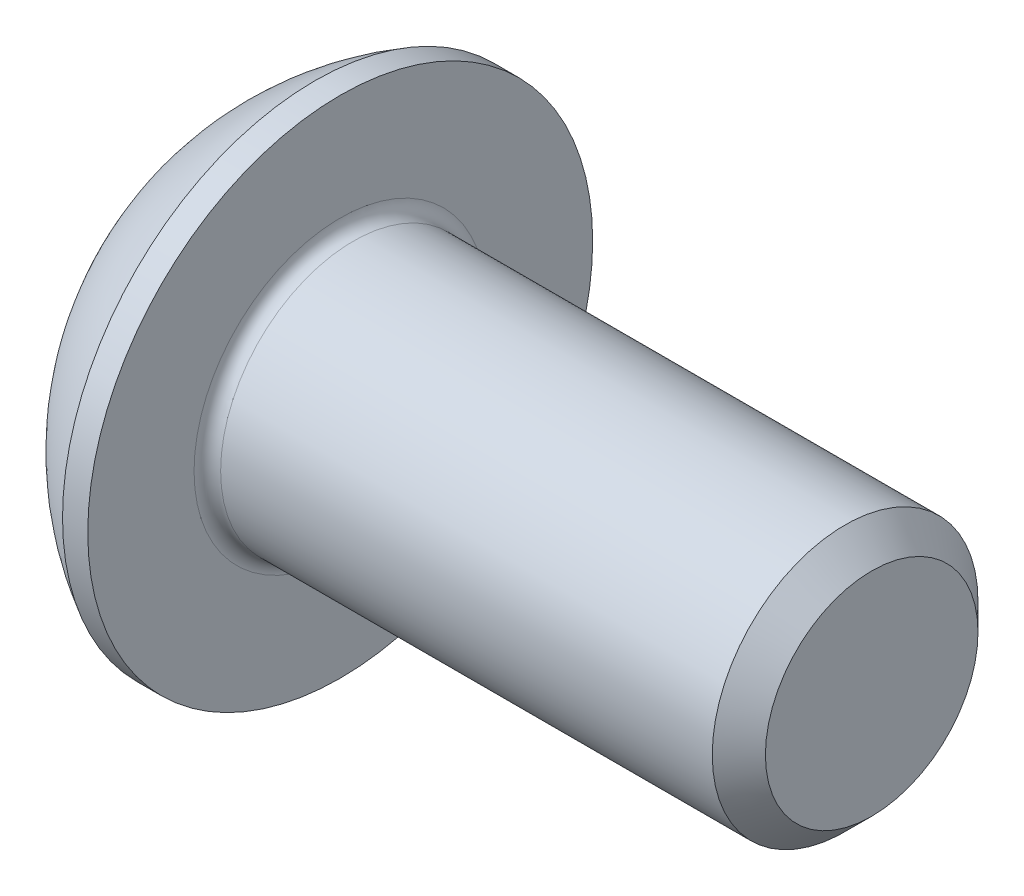
ISO-10303-21;
HEADER;
FILE_DESCRIPTION(('STEP AP214'),'2;1');
FILE_NAME('part.step','',(''),(''),'','','');
FILE_SCHEMA(('AUTOMOTIVE_DESIGN { 1 0 10303 214 1 1 1 1 }'));
ENDSEC;
DATA;
#1=APPLICATION_CONTEXT('core data for automotive mechanical design processes');
#2=APPLICATION_PROTOCOL_DEFINITION('international standard','automotive_design',2000,#1);
#3=PRODUCT_CONTEXT('',#1,'mechanical');
#4=PRODUCT('Part','Part','',(#3));
#5=PRODUCT_RELATED_PRODUCT_CATEGORY('part','',(#4));
#6=PRODUCT_DEFINITION_FORMATION('','',#4);
#7=PRODUCT_DEFINITION_CONTEXT('part definition',#1,'design');
#8=PRODUCT_DEFINITION('design','',#6,#7);
#9=PRODUCT_DEFINITION_SHAPE('','',#8);
#10=(LENGTH_UNIT() NAMED_UNIT(*) SI_UNIT(.MILLI.,.METRE.));
#11=(NAMED_UNIT(*) PLANE_ANGLE_UNIT() SI_UNIT($,.RADIAN.));
#12=(NAMED_UNIT(*) SI_UNIT($,.STERADIAN.) SOLID_ANGLE_UNIT());
#13=UNCERTAINTY_MEASURE_WITH_UNIT(LENGTH_MEASURE(1.E-05),#10,'distance_accuracy_value','');
#14=(GEOMETRIC_REPRESENTATION_CONTEXT(3) GLOBAL_UNCERTAINTY_ASSIGNED_CONTEXT((#13)) GLOBAL_UNIT_ASSIGNED_CONTEXT((#10,
#11,#12)) REPRESENTATION_CONTEXT('',''));
#15=CARTESIAN_POINT('',(0.,0.,0.));
#16=DIRECTION('',(0.,0.,1.));
#17=DIRECTION('',(1.,0.,0.));
#18=AXIS2_PLACEMENT_3D('',#15,#16,#17);
#19=CARTESIAN_POINT('',(0.,0.,0.));
#20=DIRECTION('',(-1.,0.,0.));
#21=DIRECTION('',(0.,0.,1.));
#22=AXIS2_PLACEMENT_3D('',#19,#20,#21);
#23=PLANE('',#22);
#24=CARTESIAN_POINT('',(0.,0.,0.));
#25=DIRECTION('',(-1.,0.,0.));
#26=DIRECTION('',(0.,0.,1.));
#27=AXIS2_PLACEMENT_3D('',#24,#25,#26);
#28=CIRCLE('',#27,1.9);
#29=CARTESIAN_POINT('',(0.,1.9,0.));
#30=VERTEX_POINT('',#29);
#31=EDGE_CURVE('E158',#30,#30,#28,.T.);
#32=ORIENTED_EDGE('',*,*,#31,.T.);
#33=EDGE_LOOP('',(#32));
#34=FACE_BOUND('',#33,.T.);
#35=DIRECTION('',(0.,-1.,0.));
#36=VECTOR('',#35,1.);
#37=CARTESIAN_POINT('',(0.,-0.721687836487032,1.25));
#38=LINE('',#37,#36);
#39=CARTESIAN_POINT('',(0.,0.721687836487033,1.25));
#40=VERTEX_POINT('',#39);
#41=CARTESIAN_POINT('',(0.,-0.721687836487032,1.25));
#42=VERTEX_POINT('',#41);
#43=EDGE_CURVE('E59',#40,#42,#38,.T.);
#44=ORIENTED_EDGE('',*,*,#43,.T.);
#45=DIRECTION('',(0.,-0.5,-0.866025403784438));
#46=VECTOR('',#45,1.);
#47=CARTESIAN_POINT('',(0.,-1.44337567297406,0.));
#48=LINE('',#47,#46);
#49=CARTESIAN_POINT('',(0.,-1.44337567297406,0.));
#50=VERTEX_POINT('',#49);
#51=EDGE_CURVE('E294',#42,#50,#48,.T.);
#52=ORIENTED_EDGE('',*,*,#51,.T.);
#53=DIRECTION('',(0.,0.5,-0.866025403784438));
#54=VECTOR('',#53,1.);
#55=CARTESIAN_POINT('',(0.,-0.721687836487032,-1.25));
#56=LINE('',#55,#54);
#57=CARTESIAN_POINT('',(0.,-0.721687836487032,-1.25));
#58=VERTEX_POINT('',#57);
#59=EDGE_CURVE('E139',#50,#58,#56,.T.);
#60=ORIENTED_EDGE('',*,*,#59,.T.);
#61=DIRECTION('',(0.,1.,0.));
#62=VECTOR('',#61,1.);
#63=CARTESIAN_POINT('',(0.,0.721687836487033,-1.25));
#64=LINE('',#63,#62);
#65=CARTESIAN_POINT('',(0.,0.721687836487033,-1.25));
#66=VERTEX_POINT('',#65);
#67=EDGE_CURVE('E297',#58,#66,#64,.T.);
#68=ORIENTED_EDGE('',*,*,#67,.T.);
#69=DIRECTION('',(0.,0.5,0.866025403784439));
#70=VECTOR('',#69,1.);
#71=CARTESIAN_POINT('',(0.,1.44337567297406,0.));
#72=LINE('',#71,#70);
#73=CARTESIAN_POINT('',(0.,1.44337567297406,0.));
#74=VERTEX_POINT('',#73);
#75=EDGE_CURVE('E299',#66,#74,#72,.T.);
#76=ORIENTED_EDGE('',*,*,#75,.T.);
#77=DIRECTION('',(0.,-0.5,0.866025403784439));
#78=VECTOR('',#77,1.);
#79=CARTESIAN_POINT('',(0.,0.721687836487033,1.25));
#80=LINE('',#79,#78);
#81=EDGE_CURVE('E301',#74,#40,#80,.T.);
#82=ORIENTED_EDGE('',*,*,#81,.T.);
#83=EDGE_LOOP('',(#44,#52,#60,#68,#76,#82));
#84=FACE_BOUND('',#83,.T.);
#85=ADVANCED_FACE('F43',(#34,#84),#23,.T.);
#86=CARTESIAN_POINT('',(3.88527472527473,0.,0.));
#87=DIRECTION('',(-1.,0.,0.));
#88=DIRECTION('',(0.,1.,0.));
#89=AXIS2_PLACEMENT_3D('',#86,#87,#88);
#90=SPHERICAL_SURFACE('',#89,4.3249693283142);
#91=CARTESIAN_POINT('',(1.82,0.,0.));
#92=DIRECTION('',(-1.,0.,0.));
#93=DIRECTION('',(0.,0.,1.));
#94=AXIS2_PLACEMENT_3D('',#91,#92,#93);
#95=CIRCLE('',#94,3.8);
#96=CARTESIAN_POINT('',(1.82,3.8,0.));
#97=VERTEX_POINT('',#96);
#98=EDGE_CURVE('E155',#97,#97,#95,.T.);
#99=CARTESIAN_POINT('',(1.82,3.8,0.));
#100=CARTESIAN_POINT('',(1.79553223778235,3.78670197498787,0.));
#101=CARTESIAN_POINT('',(1.77119294730718,3.77316757105695,0.));
#102=CARTESIAN_POINT('',(1.72278031308152,3.74563119292022,0.));
#103=CARTESIAN_POINT('',(1.69870696933104,3.7316292187144,0.));
#104=CARTESIAN_POINT('',(1.65083523179446,3.7031628875906,0.));
#105=CARTESIAN_POINT('',(1.62703683800837,3.6886985306726,0.));
#106=CARTESIAN_POINT('',(1.57972387446203,3.65931284095831,0.));
#107=CARTESIAN_POINT('',(1.55620930470177,3.64439150816201,0.));
#108=CARTESIAN_POINT('',(1.50947276449225,3.61409743150663,0.));
#109=CARTESIAN_POINT('',(1.48625079404298,3.59872468764754,0.));
#110=CARTESIAN_POINT('',(1.44010811665664,3.56753352546924,0.));
#111=CARTESIAN_POINT('',(1.41718740971957,3.55171510715004,0.));
#112=CARTESIAN_POINT('',(1.37165581166264,3.51963849804541,0.));
#113=CARTESIAN_POINT('',(1.34904492054277,3.50338030725998,0.));
#114=CARTESIAN_POINT('',(1.30414139068938,3.47043021954608,0.));
#115=CARTESIAN_POINT('',(1.28184875195586,3.4537383226176,0.));
#116=CARTESIAN_POINT('',(1.23759004473439,3.41992705070111,0.));
#117=CARTESIAN_POINT('',(1.21562397624644,3.40280767571308,0.));
#118=CARTESIAN_POINT('',(1.17202660551528,3.3681478352793,0.));
#119=CARTESIAN_POINT('',(1.15039530327208,3.35060736983354,0.));
#120=CARTESIAN_POINT('',(1.10747553612391,3.31511189319918,0.));
#121=CARTESIAN_POINT('',(1.08618707121895,3.29715688201057,0.));
#122=CARTESIAN_POINT('',(1.04396092192025,3.26083901328234,0.));
#123=CARTESIAN_POINT('',(1.02302323752651,3.24247615574272,0.));
#124=CARTESIAN_POINT('',(0.981506461539866,3.20534944588,0.));
#125=CARTESIAN_POINT('',(0.960927369946953,3.18658559355691,0.));
#126=CARTESIAN_POINT('',(0.920135458053,3.14866389531445,0.));
#127=CARTESIAN_POINT('',(0.89992263775196,3.12950604939509,0.));
#128=CARTESIAN_POINT('',(0.859870810269304,3.09080351215454,0.));
#129=CARTESIAN_POINT('',(0.84003180308769,3.07125882083336,0.));
#130=CARTESIAN_POINT('',(0.800735004193914,3.0317898853238,0.));
#131=CARTESIAN_POINT('',(0.781277212481753,3.01186564113541,0.));
#132=CARTESIAN_POINT('',(0.74275010463742,2.97164503404517,0.));
#133=CARTESIAN_POINT('',(0.723680788505248,2.95134867114332,0.));
#134=CARTESIAN_POINT('',(0.685937746983035,2.91039139962521,0.));
#135=CARTESIAN_POINT('',(0.667264021592994,2.88973049100894,0.));
#136=CARTESIAN_POINT('',(0.630319129113974,2.84805183708071,0.));
#137=CARTESIAN_POINT('',(0.612047962024996,2.82703409176873,0.));
#138=CARTESIAN_POINT('',(0.575915003504077,2.78464960661105,0.));
#139=CARTESIAN_POINT('',(0.558053212072136,2.76328286676534,0.));
#140=CARTESIAN_POINT('',(0.522745669474639,2.72020836491933,0.));
#141=CARTESIAN_POINT('',(0.505299918309083,2.69850060291903,0.));
#142=CARTESIAN_POINT('',(0.470830965620255,2.65475215638556,0.));
#143=CARTESIAN_POINT('',(0.453807764096983,2.63271147185239,0.));
#144=CARTESIAN_POINT('',(0.420190262406823,2.58830540409509,0.));
#145=CARTESIAN_POINT('',(0.403595962239934,2.56594002087097,0.));
#146=CARTESIAN_POINT('',(0.370842454943267,2.52089290072626,0.));
#147=CARTESIAN_POINT('',(0.354683247813489,2.49821116380567,0.));
#148=CARTESIAN_POINT('',(0.322805955934172,2.45253979929826,0.));
#149=CARTESIAN_POINT('',(0.307087871184632,2.42955017171145,0.));
#150=CARTESIAN_POINT('',(0.276098688799191,2.38327160379141,0.));
#151=CARTESIAN_POINT('',(0.26082759116329,2.35998266345818,0.));
#152=CARTESIAN_POINT('',(0.230738081024336,2.31311415961106,0.));
#153=CARTESIAN_POINT('',(0.215919668521284,2.28953459609717,0.));
#154=CARTESIAN_POINT('',(0.186741057514276,2.24209364401868,0.));
#155=CARTESIAN_POINT('',(0.172380859010322,2.21823225545407,0.));
#156=CARTESIAN_POINT('',(0.144124034818959,2.17023655608655,0.));
#157=CARTESIAN_POINT('',(0.13022740913155,2.14610224528364,0.));
#158=CARTESIAN_POINT('',(0.102902912986768,2.09756970784785,0.));
#159=CARTESIAN_POINT('',(0.0894750425293929,2.07317148121498,0.));
#160=CARTESIAN_POINT('',(0.0630930771761377,2.02412021042083,0.));
#161=CARTESIAN_POINT('',(0.0501389822802572,1.99946716625955,0.));
#162=CARTESIAN_POINT('',(0.0247093637594994,1.94991547834234,0.));
#163=CARTESIAN_POINT('',(0.0122338401346221,1.9250168345864,0.));
#164=CARTESIAN_POINT('',(0.,1.9,0.));
#165=B_SPLINE_CURVE_WITH_KNOTS('',3,(#99,#100,#101,#102,#103,#104,#105,#106,#107,#108,#109,#110,
#111,#112,#113,#114,#115,#116,#117,#118,#119,#120,#121,#122,#123,#124,#125,#126,#127,#128,#129,
#130,#131,#132,#133,#134,#135,#136,#137,#138,#139,#140,#141,#142,#143,#144,#145,#146,#147,#148,
#149,#150,#151,#152,#153,#154,#155,#156,#157,#158,#159,#160,#161,#162,#163,#164),.UNSPECIFIED.,
.F.,.F.,(4,2,2,2,2,2,2,2,2,2,2,2,2,2,2,2,2,2,2,2,2,2,2,2,2,2,2,2,2,2,2,2,4),(0.,
0.083542578086179,0.167085156172358,0.250627734258537,0.334170312344716,0.417712890430896,
0.501255468517075,0.584798046603254,0.668340624689433,0.751883202775612,0.835425780861791,
0.91896835894797,1.00251093703415,1.08605351512033,1.16959609320651,1.25313867129269,
1.33668124937887,1.42022382746504,1.50376640555122,1.5873089836374,1.67085156172358,
1.75439413980976,1.83793671789594,1.92147929598212,2.0050218740683,2.08856445215448,
2.17210703024066,2.25564960832684,2.33919218641302,2.42273476449919,2.50627734258537,
2.58981992067155,2.67336249875773),.UNSPECIFIED.);
#166=EDGE_CURVE('BSEAM180',#97,#30,#165,.T.);
#167=ORIENTED_EDGE('',*,*,#98,.T.);
#168=ORIENTED_EDGE('',*,*,#31,.F.);
#169=ORIENTED_EDGE('',*,*,#166,.T.);
#170=ORIENTED_EDGE('',*,*,#166,.F.);
#171=EDGE_LOOP('',(#167,#169,#168,#170));
#172=FACE_BOUND('',#171,.T.);
#173=ADVANCED_FACE('F180',(#172),#90,.T.);
#174=CARTESIAN_POINT('',(0.,0.,0.));
#175=DIRECTION('',(-1.,0.,0.));
#176=DIRECTION('',(0.,0.,1.));
#177=AXIS2_PLACEMENT_3D('',#174,#175,#176);
#178=CYLINDRICAL_SURFACE('',#177,3.8);
#179=ORIENTED_EDGE('',*,*,#98,.F.);
#180=EDGE_LOOP('',(#179));
#181=FACE_BOUND('',#180,.T.);
#182=CARTESIAN_POINT('',(2.2,0.,0.));
#183=DIRECTION('',(-1.,0.,0.));
#184=DIRECTION('',(0.,0.,1.));
#185=AXIS2_PLACEMENT_3D('',#182,#183,#184);
#186=CIRCLE('',#185,3.8);
#187=CARTESIAN_POINT('',(2.2,0.,3.8));
#188=VERTEX_POINT('',#187);
#189=EDGE_CURVE('E151',#188,#188,#186,.T.);
#190=ORIENTED_EDGE('',*,*,#189,.T.);
#191=EDGE_LOOP('',(#190));
#192=FACE_BOUND('',#191,.T.);
#193=ADVANCED_FACE('F187',(#181,#192),#178,.T.);
#194=CARTESIAN_POINT('',(2.2,2.,0.));
#195=DIRECTION('',(-1.,0.,0.));
#196=DIRECTION('',(0.,0.,1.));
#197=AXIS2_PLACEMENT_3D('',#194,#195,#196);
#198=PLANE('',#197);
#199=CARTESIAN_POINT('',(2.2,0.,0.));
#200=DIRECTION('',(-1.,0.,0.));
#201=DIRECTION('',(0.,0.,1.));
#202=AXIS2_PLACEMENT_3D('',#199,#200,#201);
#203=CIRCLE('',#202,2.2);
#204=CARTESIAN_POINT('',(2.2,0.,2.2));
#205=VERTEX_POINT('',#204);
#206=EDGE_CURVE('E161',#205,#205,#203,.T.);
#207=ORIENTED_EDGE('',*,*,#206,.T.);
#208=EDGE_LOOP('',(#207));
#209=FACE_BOUND('',#208,.T.);
#210=ORIENTED_EDGE('',*,*,#189,.F.);
#211=EDGE_LOOP('',(#210));
#212=FACE_BOUND('',#211,.T.);
#213=ADVANCED_FACE('F199',(#209,#212),#198,.F.);
#214=CARTESIAN_POINT('',(0.,0.,0.));
#215=DIRECTION('',(-1.,0.,0.));
#216=DIRECTION('',(0.,0.,1.));
#217=AXIS2_PLACEMENT_3D('',#214,#215,#216);
#218=CYLINDRICAL_SURFACE('',#217,2.);
#219=CARTESIAN_POINT('',(9.8,0.,0.));
#220=DIRECTION('',(-1.,0.,0.));
#221=DIRECTION('',(0.,0.,1.));
#222=AXIS2_PLACEMENT_3D('',#219,#220,#221);
#223=CIRCLE('',#222,2.);
#224=CARTESIAN_POINT('',(9.8,0.,2.));
#225=VERTEX_POINT('',#224);
#226=EDGE_CURVE('E11',#225,#225,#223,.T.);
#227=ORIENTED_EDGE('',*,*,#226,.T.);
#228=EDGE_LOOP('',(#227));
#229=FACE_BOUND('',#228,.T.);
#230=CARTESIAN_POINT('',(2.4,0.,0.));
#231=DIRECTION('',(-1.,0.,0.));
#232=DIRECTION('',(0.,0.,1.));
#233=AXIS2_PLACEMENT_3D('',#230,#231,#232);
#234=CIRCLE('',#233,2.);
#235=CARTESIAN_POINT('',(2.4,0.,2.));
#236=VERTEX_POINT('',#235);
#237=EDGE_CURVE('E164',#236,#236,#234,.F.);
#238=ORIENTED_EDGE('',*,*,#237,.T.);
#239=EDGE_LOOP('',(#238));
#240=FACE_BOUND('',#239,.T.);
#241=ADVANCED_FACE('F193',(#229,#240),#218,.T.);
#242=CARTESIAN_POINT('',(2.4,0.,0.));
#243=DIRECTION('',(-1.,0.,0.));
#244=DIRECTION('',(0.,0.,1.));
#245=AXIS2_PLACEMENT_3D('',#242,#243,#244);
#246=TOROIDAL_SURFACE('',#245,2.2,0.2);
#247=ORIENTED_EDGE('',*,*,#237,.F.);
#248=EDGE_LOOP('',(#247));
#249=FACE_BOUND('',#248,.T.);
#250=ORIENTED_EDGE('',*,*,#206,.F.);
#251=EDGE_LOOP('',(#250));
#252=FACE_BOUND('',#251,.T.);
#253=ADVANCED_FACE('F191',(#249,#252),#246,.F.);
#254=CARTESIAN_POINT('',(1.3,-1.44337567297406,0.));
#255=DIRECTION('',(0.,0.866025403784438,-0.5));
#256=DIRECTION('',(0.,0.5,0.866025403784438));
#257=AXIS2_PLACEMENT_3D('',#254,#255,#256);
#258=PLANE('',#257);
#259=DIRECTION('',(0.,-0.5,-0.866025403784438));
#260=VECTOR('',#259,1.);
#261=CARTESIAN_POINT('',(1.3,-1.44337567297406,0.));
#262=LINE('',#261,#260);
#263=CARTESIAN_POINT('',(1.3,-0.721687836487032,1.25));
#264=VERTEX_POINT('',#263);
#265=CARTESIAN_POINT('',(1.3,-1.08253175473055,0.625));
#266=VERTEX_POINT('',#265);
#267=EDGE_CURVE('E125',#264,#266,#262,.T.);
#268=ORIENTED_EDGE('',*,*,#267,.T.);
#269=CARTESIAN_POINT('',(1.3,-1.44337567297406,0.));
#270=VERTEX_POINT('',#269);
#271=EDGE_CURVE('E120',#266,#270,#262,.T.);
#272=ORIENTED_EDGE('',*,*,#271,.T.);
#273=DIRECTION('',(-1.,0.,0.));
#274=VECTOR('',#273,1.);
#275=CARTESIAN_POINT('',(1.3,-1.44337567297406,0.));
#276=LINE('',#275,#274);
#277=EDGE_CURVE('E122',#270,#50,#276,.T.);
#278=ORIENTED_EDGE('',*,*,#277,.T.);
#279=ORIENTED_EDGE('',*,*,#51,.F.);
#280=DIRECTION('',(-1.,0.,0.));
#281=VECTOR('',#280,1.);
#282=CARTESIAN_POINT('',(1.3,-0.721687836487032,1.25));
#283=LINE('',#282,#281);
#284=EDGE_CURVE('E290',#264,#42,#283,.T.);
#285=ORIENTED_EDGE('',*,*,#284,.F.);
#286=EDGE_LOOP('',(#268,#272,#278,#279,#285));
#287=FACE_BOUND('',#286,.T.);
#288=ADVANCED_FACE('F121',(#287),#258,.T.);
#289=CARTESIAN_POINT('',(1.3,-0.721687836487032,-1.25));
#290=DIRECTION('',(0.,0.866025403784439,0.5));
#291=DIRECTION('',(0.,-0.5,0.866025403784439));
#292=AXIS2_PLACEMENT_3D('',#289,#290,#291);
#293=PLANE('',#292);
#294=DIRECTION('',(0.,0.5,-0.866025403784438));
#295=VECTOR('',#294,1.);
#296=CARTESIAN_POINT('',(1.3,-0.721687836487032,-1.25));
#297=LINE('',#296,#295);
#298=CARTESIAN_POINT('',(1.3,-1.08253175473055,-0.625));
#299=VERTEX_POINT('',#298);
#300=EDGE_CURVE('E67',#270,#299,#297,.T.);
#301=ORIENTED_EDGE('',*,*,#300,.T.);
#302=CARTESIAN_POINT('',(1.3,-0.721687836487032,-1.25));
#303=VERTEX_POINT('',#302);
#304=EDGE_CURVE('E134',#299,#303,#297,.T.);
#305=ORIENTED_EDGE('',*,*,#304,.T.);
#306=DIRECTION('',(-1.,0.,0.));
#307=VECTOR('',#306,1.);
#308=CARTESIAN_POINT('',(1.3,-0.721687836487032,-1.25));
#309=LINE('',#308,#307);
#310=EDGE_CURVE('E141',#303,#58,#309,.T.);
#311=ORIENTED_EDGE('',*,*,#310,.T.);
#312=ORIENTED_EDGE('',*,*,#59,.F.);
#313=ORIENTED_EDGE('',*,*,#277,.F.);
#314=EDGE_LOOP('',(#301,#305,#311,#312,#313));
#315=FACE_BOUND('',#314,.T.);
#316=ADVANCED_FACE('F137',(#315),#293,.T.);
#317=CARTESIAN_POINT('',(1.3,0.721687836487033,-1.25));
#318=DIRECTION('',(0.,0.,1.));
#319=DIRECTION('',(1.,0.,0.));
#320=AXIS2_PLACEMENT_3D('',#317,#318,#319);
#321=PLANE('',#320);
#322=DIRECTION('',(0.,1.,0.));
#323=VECTOR('',#322,1.);
#324=CARTESIAN_POINT('',(1.3,0.721687836487033,-1.25));
#325=LINE('',#324,#323);
#326=CARTESIAN_POINT('',(1.3,0.,-1.25));
#327=VERTEX_POINT('',#326);
#328=EDGE_CURVE('E271',#303,#327,#325,.T.);
#329=ORIENTED_EDGE('',*,*,#328,.T.);
#330=CARTESIAN_POINT('',(1.3,0.721687836487033,-1.25));
#331=VERTEX_POINT('',#330);
#332=EDGE_CURVE('E133',#327,#331,#325,.T.);
#333=ORIENTED_EDGE('',*,*,#332,.T.);
#334=DIRECTION('',(-1.,0.,0.));
#335=VECTOR('',#334,1.);
#336=CARTESIAN_POINT('',(1.3,0.721687836487033,-1.25));
#337=LINE('',#336,#335);
#338=EDGE_CURVE('E146',#331,#66,#337,.T.);
#339=ORIENTED_EDGE('',*,*,#338,.T.);
#340=ORIENTED_EDGE('',*,*,#67,.F.);
#341=ORIENTED_EDGE('',*,*,#310,.F.);
#342=EDGE_LOOP('',(#329,#333,#339,#340,#341));
#343=FACE_BOUND('',#342,.T.);
#344=ADVANCED_FACE('F223',(#343),#321,.T.);
#345=CARTESIAN_POINT('',(1.3,1.44337567297406,0.));
#346=DIRECTION('',(0.,-0.866025403784439,0.5));
#347=DIRECTION('',(0.,-0.5,-0.866025403784439));
#348=AXIS2_PLACEMENT_3D('',#345,#346,#347);
#349=PLANE('',#348);
#350=DIRECTION('',(0.,0.5,0.866025403784439));
#351=VECTOR('',#350,1.);
#352=CARTESIAN_POINT('',(1.3,1.44337567297406,0.));
#353=LINE('',#352,#351);
#354=CARTESIAN_POINT('',(1.3,1.08253175473055,-0.625));
#355=VERTEX_POINT('',#354);
#356=EDGE_CURVE('E260',#331,#355,#353,.T.);
#357=ORIENTED_EDGE('',*,*,#356,.T.);
#358=CARTESIAN_POINT('',(1.3,1.44337567297406,0.));
#359=VERTEX_POINT('',#358);
#360=EDGE_CURVE('E265',#355,#359,#353,.T.);
#361=ORIENTED_EDGE('',*,*,#360,.T.);
#362=DIRECTION('',(-1.,0.,0.));
#363=VECTOR('',#362,1.);
#364=CARTESIAN_POINT('',(1.3,1.44337567297406,0.));
#365=LINE('',#364,#363);
#366=EDGE_CURVE('E305',#359,#74,#365,.T.);
#367=ORIENTED_EDGE('',*,*,#366,.T.);
#368=ORIENTED_EDGE('',*,*,#75,.F.);
#369=ORIENTED_EDGE('',*,*,#338,.F.);
#370=EDGE_LOOP('',(#357,#361,#367,#368,#369));
#371=FACE_BOUND('',#370,.T.);
#372=ADVANCED_FACE('F226',(#371),#349,.T.);
#373=CARTESIAN_POINT('',(1.3,0.721687836487033,1.25));
#374=DIRECTION('',(0.,-0.866025403784439,-0.5));
#375=DIRECTION('',(0.,0.5,-0.866025403784439));
#376=AXIS2_PLACEMENT_3D('',#373,#374,#375);
#377=PLANE('',#376);
#378=DIRECTION('',(0.,-0.5,0.866025403784439));
#379=VECTOR('',#378,1.);
#380=CARTESIAN_POINT('',(1.3,0.721687836487033,1.25));
#381=LINE('',#380,#379);
#382=CARTESIAN_POINT('',(1.3,1.08253175473055,0.625));
#383=VERTEX_POINT('',#382);
#384=EDGE_CURVE('E268',#359,#383,#381,.T.);
#385=ORIENTED_EDGE('',*,*,#384,.T.);
#386=CARTESIAN_POINT('',(1.3,0.721687836487033,1.25));
#387=VERTEX_POINT('',#386);
#388=EDGE_CURVE('E276',#383,#387,#381,.T.);
#389=ORIENTED_EDGE('',*,*,#388,.T.);
#390=DIRECTION('',(-1.,0.,0.));
#391=VECTOR('',#390,1.);
#392=CARTESIAN_POINT('',(1.3,0.721687836487033,1.25));
#393=LINE('',#392,#391);
#394=EDGE_CURVE('E289',#387,#40,#393,.T.);
#395=ORIENTED_EDGE('',*,*,#394,.T.);
#396=ORIENTED_EDGE('',*,*,#81,.F.);
#397=ORIENTED_EDGE('',*,*,#366,.F.);
#398=EDGE_LOOP('',(#385,#389,#395,#396,#397));
#399=FACE_BOUND('',#398,.T.);
#400=ADVANCED_FACE('F230',(#399),#377,.T.);
#401=CARTESIAN_POINT('',(1.3,-0.721687836487032,1.25));
#402=DIRECTION('',(0.,0.,-1.));
#403=DIRECTION('',(-1.,0.,0.));
#404=AXIS2_PLACEMENT_3D('',#401,#402,#403);
#405=PLANE('',#404);
#406=DIRECTION('',(0.,-1.,0.));
#407=VECTOR('',#406,1.);
#408=CARTESIAN_POINT('',(1.3,-0.721687836487032,1.25));
#409=LINE('',#408,#407);
#410=CARTESIAN_POINT('',(1.3,0.,1.25));
#411=VERTEX_POINT('',#410);
#412=EDGE_CURVE('E282',#387,#411,#409,.T.);
#413=ORIENTED_EDGE('',*,*,#412,.T.);
#414=EDGE_CURVE('E284',#411,#264,#409,.T.);
#415=ORIENTED_EDGE('',*,*,#414,.T.);
#416=ORIENTED_EDGE('',*,*,#284,.T.);
#417=ORIENTED_EDGE('',*,*,#43,.F.);
#418=ORIENTED_EDGE('',*,*,#394,.F.);
#419=EDGE_LOOP('',(#413,#415,#416,#417,#418));
#420=FACE_BOUND('',#419,.T.);
#421=ADVANCED_FACE('F234',(#420),#405,.T.);
#422=CARTESIAN_POINT('',(1.3,-1.44337567297406,0.));
#423=DIRECTION('',(1.,0.,0.));
#424=DIRECTION('',(0.,0.,-1.));
#425=AXIS2_PLACEMENT_3D('',#422,#423,#424);
#426=PLANE('',#425);
#427=CARTESIAN_POINT('',(1.3,0.,0.));
#428=DIRECTION('',(-1.,0.,0.));
#429=DIRECTION('',(0.,0.,1.));
#430=AXIS2_PLACEMENT_3D('',#427,#428,#429);
#431=CIRCLE('',#430,1.25);
#432=EDGE_CURVE('E257',#355,#327,#431,.T.);
#433=ORIENTED_EDGE('',*,*,#432,.F.);
#434=ORIENTED_EDGE('',*,*,#356,.F.);
#435=ORIENTED_EDGE('',*,*,#332,.F.);
#436=EDGE_LOOP('',(#433,#434,#435));
#437=FACE_BOUND('',#436,.T.);
#438=ADVANCED_FACE('F238',(#437),#426,.F.);
#439=EDGE_CURVE('E152',#383,#355,#431,.T.);
#440=ORIENTED_EDGE('',*,*,#439,.F.);
#441=ORIENTED_EDGE('',*,*,#384,.F.);
#442=ORIENTED_EDGE('',*,*,#360,.F.);
#443=EDGE_LOOP('',(#440,#441,#442));
#444=FACE_BOUND('',#443,.T.);
#445=ADVANCED_FACE('F247',(#444),#426,.F.);
#446=EDGE_CURVE('E145',#411,#383,#431,.T.);
#447=ORIENTED_EDGE('',*,*,#446,.F.);
#448=ORIENTED_EDGE('',*,*,#412,.F.);
#449=ORIENTED_EDGE('',*,*,#388,.F.);
#450=EDGE_LOOP('',(#447,#448,#449));
#451=FACE_BOUND('',#450,.T.);
#452=ADVANCED_FACE('F252',(#451),#426,.F.);
#453=EDGE_CURVE('E140',#266,#411,#431,.T.);
#454=ORIENTED_EDGE('',*,*,#453,.F.);
#455=ORIENTED_EDGE('',*,*,#267,.F.);
#456=ORIENTED_EDGE('',*,*,#414,.F.);
#457=EDGE_LOOP('',(#454,#455,#456));
#458=FACE_BOUND('',#457,.T.);
#459=ADVANCED_FACE('F245',(#458),#426,.F.);
#460=EDGE_CURVE('E131',#299,#266,#431,.T.);
#461=ORIENTED_EDGE('',*,*,#460,.F.);
#462=ORIENTED_EDGE('',*,*,#300,.F.);
#463=ORIENTED_EDGE('',*,*,#271,.F.);
#464=EDGE_LOOP('',(#461,#462,#463));
#465=FACE_BOUND('',#464,.T.);
#466=ADVANCED_FACE('F130',(#465),#426,.F.);
#467=EDGE_CURVE('E263',#327,#299,#431,.T.);
#468=ORIENTED_EDGE('',*,*,#467,.F.);
#469=ORIENTED_EDGE('',*,*,#328,.F.);
#470=ORIENTED_EDGE('',*,*,#304,.F.);
#471=EDGE_LOOP('',(#468,#469,#470));
#472=FACE_BOUND('',#471,.T.);
#473=ADVANCED_FACE('F218',(#472),#426,.F.);
#474=CARTESIAN_POINT('',(2.02168783648704,0.,0.));
#475=DIRECTION('',(-1.,0.,0.));
#476=DIRECTION('',(0.,0.,1.));
#477=AXIS2_PLACEMENT_3D('',#474,#475,#476);
#478=CONICAL_SURFACE('',#477,0.,1.0471975511966);
#479=ORIENTED_EDGE('',*,*,#446,.T.);
#480=ORIENTED_EDGE('',*,*,#439,.T.);
#481=ORIENTED_EDGE('',*,*,#432,.T.);
#482=ORIENTED_EDGE('',*,*,#467,.T.);
#483=ORIENTED_EDGE('',*,*,#460,.T.);
#484=ORIENTED_EDGE('',*,*,#453,.T.);
#485=EDGE_LOOP('',(#479,#480,#481,#482,#483,#484));
#486=FACE_BOUND('',#485,.T.);
#487=CARTESIAN_POINT('',(2.02168783648704,0.,0.));
#488=VERTEX_POINT('',#487);
#489=VERTEX_LOOP('',#488);
#490=FACE_BOUND('',#489,.T.);
#491=ADVANCED_FACE('F176',(#486,#490),#478,.F.);
#492=CARTESIAN_POINT('',(10.2,0.,0.));
#493=DIRECTION('',(-1.,0.,0.));
#494=DIRECTION('',(0.,0.,1.));
#495=AXIS2_PLACEMENT_3D('',#492,#493,#494);
#496=PLANE('',#495);
#497=CARTESIAN_POINT('',(10.2,0.,0.));
#498=DIRECTION('',(-1.,0.,0.));
#499=DIRECTION('',(0.,0.,1.));
#500=AXIS2_PLACEMENT_3D('',#497,#498,#499);
#501=CIRCLE('',#500,1.6);
#502=CARTESIAN_POINT('',(10.2,0.,1.6));
#503=VERTEX_POINT('',#502);
#504=EDGE_CURVE('E52',#503,#503,#501,.F.);
#505=ORIENTED_EDGE('',*,*,#504,.T.);
#506=EDGE_LOOP('',(#505));
#507=FACE_BOUND('',#506,.T.);
#508=ADVANCED_FACE('F169',(#507),#496,.F.);
#509=CARTESIAN_POINT('',(10.2,0.,0.));
#510=DIRECTION('',(-1.,0.,0.));
#511=DIRECTION('',(0.,0.,1.));
#512=AXIS2_PLACEMENT_3D('',#509,#510,#511);
#513=CONICAL_SURFACE('',#512,1.6,0.785398163397448);
#514=ORIENTED_EDGE('',*,*,#226,.F.);
#515=EDGE_LOOP('',(#514));
#516=FACE_BOUND('',#515,.T.);
#517=ORIENTED_EDGE('',*,*,#504,.F.);
#518=EDGE_LOOP('',(#517));
#519=FACE_BOUND('',#518,.T.);
#520=ADVANCED_FACE('F46',(#516,#519),#513,.T.);
#521=CLOSED_SHELL('',(#85,#173,#193,#213,#241,#253,#288,#316,#344,#372,#400,#421,#438,#445,#452,
#459,#466,#473,#491,#508,#520));
#522=MANIFOLD_SOLID_BREP('B2',#521);
#523=ADVANCED_BREP_SHAPE_REPRESENTATION('',(#18,#522),#14);
#524=SHAPE_DEFINITION_REPRESENTATION(#9,#523);
ENDSEC;
END-ISO-10303-21;
